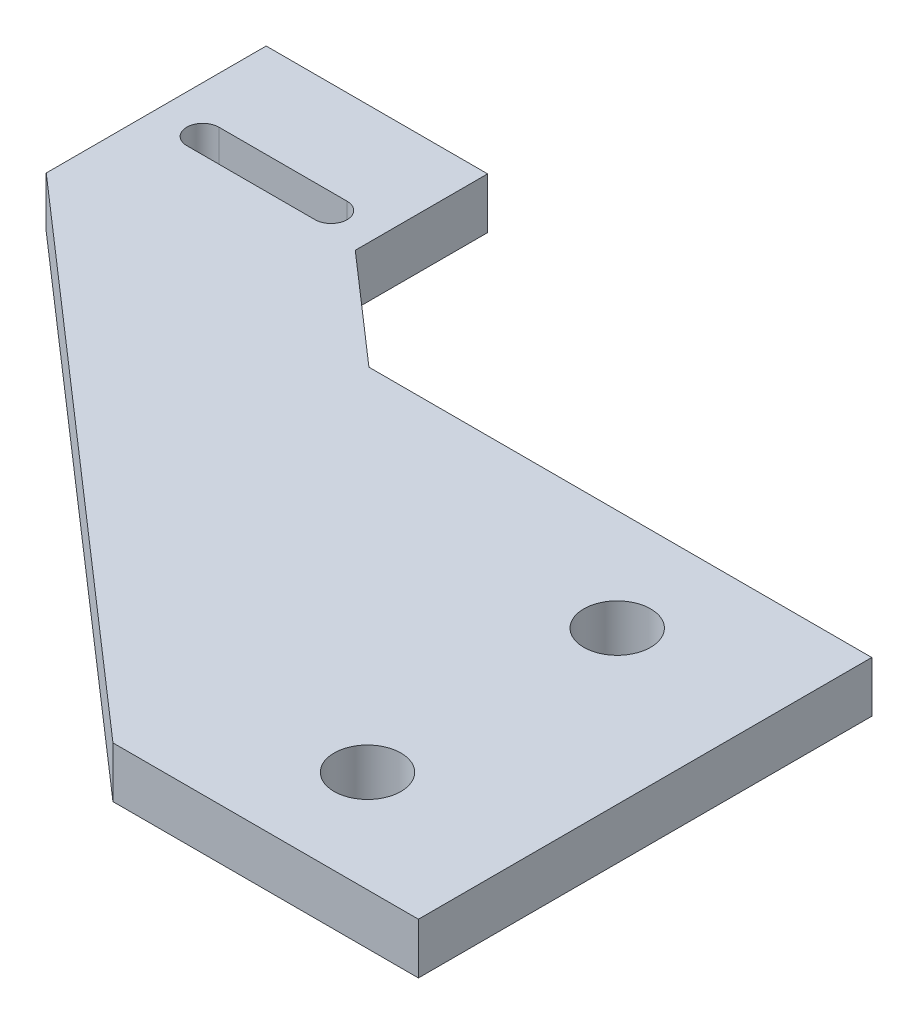
ISO-10303-21;
HEADER;
FILE_DESCRIPTION(('STEP AP214'),'2;1');
FILE_NAME('part.step','',(''),(''),'','','');
FILE_SCHEMA(('AUTOMOTIVE_DESIGN { 1 0 10303 214 1 1 1 1 }'));
ENDSEC;
DATA;
#1=APPLICATION_CONTEXT('core data for automotive mechanical design processes');
#2=APPLICATION_PROTOCOL_DEFINITION('international standard','automotive_design',2000,#1);
#3=PRODUCT_CONTEXT('',#1,'mechanical');
#4=PRODUCT('Part','Part','',(#3));
#5=PRODUCT_RELATED_PRODUCT_CATEGORY('part','',(#4));
#6=PRODUCT_DEFINITION_FORMATION('','',#4);
#7=PRODUCT_DEFINITION_CONTEXT('part definition',#1,'design');
#8=PRODUCT_DEFINITION('design','',#6,#7);
#9=PRODUCT_DEFINITION_SHAPE('','',#8);
#10=(LENGTH_UNIT() NAMED_UNIT(*) SI_UNIT(.MILLI.,.METRE.));
#11=(NAMED_UNIT(*) PLANE_ANGLE_UNIT() SI_UNIT($,.RADIAN.));
#12=(NAMED_UNIT(*) SI_UNIT($,.STERADIAN.) SOLID_ANGLE_UNIT());
#13=UNCERTAINTY_MEASURE_WITH_UNIT(LENGTH_MEASURE(1.E-05),#10,'distance_accuracy_value','');
#14=(GEOMETRIC_REPRESENTATION_CONTEXT(3) GLOBAL_UNCERTAINTY_ASSIGNED_CONTEXT((#13)) GLOBAL_UNIT_ASSIGNED_CONTEXT((#10,
#11,#12)) REPRESENTATION_CONTEXT('',''));
#15=CARTESIAN_POINT('',(0.,0.,0.));
#16=DIRECTION('',(0.,0.,1.));
#17=DIRECTION('',(1.,0.,0.));
#18=AXIS2_PLACEMENT_3D('',#15,#16,#17);
#19=CARTESIAN_POINT('',(628.65,-25.4000000000002,534.61));
#20=DIRECTION('',(1.,0.,0.));
#21=DIRECTION('',(0.,0.,-1.));
#22=AXIS2_PLACEMENT_3D('',#19,#20,#21);
#23=PLANE('',#22);
#24=DIRECTION('',(0.,0.,-1.));
#25=VECTOR('',#24,1.);
#26=CARTESIAN_POINT('',(628.65,-19.0500000000002,534.61));
#27=LINE('',#26,#25);
#28=CARTESIAN_POINT('',(628.65,-19.0500000000002,591.155));
#29=VERTEX_POINT('',#28);
#30=CARTESIAN_POINT('',(628.65,-19.0500000000002,534.61));
#31=VERTEX_POINT('',#30);
#32=EDGE_CURVE('E160',#29,#31,#27,.T.);
#33=ORIENTED_EDGE('',*,*,#32,.F.);
#34=DIRECTION('',(0.,1.,0.));
#35=VECTOR('',#34,1.);
#36=CARTESIAN_POINT('',(628.65,-25.4000000000002,591.155));
#37=LINE('',#36,#35);
#38=CARTESIAN_POINT('',(628.65,-25.4000000000002,591.155));
#39=VERTEX_POINT('',#38);
#40=EDGE_CURVE('E11',#39,#29,#37,.T.);
#41=ORIENTED_EDGE('',*,*,#40,.F.);
#42=DIRECTION('',(0.,0.,-1.));
#43=VECTOR('',#42,1.);
#44=CARTESIAN_POINT('',(628.65,-25.4000000000002,534.61));
#45=LINE('',#44,#43);
#46=CARTESIAN_POINT('',(628.65,-25.4000000000002,534.61));
#47=VERTEX_POINT('',#46);
#48=EDGE_CURVE('E164',#39,#47,#45,.T.);
#49=ORIENTED_EDGE('',*,*,#48,.T.);
#50=DIRECTION('',(0.,1.,0.));
#51=VECTOR('',#50,1.);
#52=CARTESIAN_POINT('',(628.65,-25.4000000000002,534.61));
#53=LINE('',#52,#51);
#54=EDGE_CURVE('E189',#47,#31,#53,.T.);
#55=ORIENTED_EDGE('',*,*,#54,.T.);
#56=EDGE_LOOP('',(#33,#41,#49,#55));
#57=FACE_BOUND('',#56,.T.);
#58=ADVANCED_FACE('F34',(#57),#23,.T.);
#59=CARTESIAN_POINT('',(590.55,-25.4000000000002,591.155));
#60=DIRECTION('',(0.,0.,1.));
#61=DIRECTION('',(1.,0.,0.));
#62=AXIS2_PLACEMENT_3D('',#59,#60,#61);
#63=PLANE('',#62);
#64=DIRECTION('',(1.,0.,0.));
#65=VECTOR('',#64,1.);
#66=CARTESIAN_POINT('',(590.55,-19.0500000000002,591.155));
#67=LINE('',#66,#65);
#68=CARTESIAN_POINT('',(590.55,-19.0500000000002,591.155));
#69=VERTEX_POINT('',#68);
#70=EDGE_CURVE('E168',#69,#29,#67,.T.);
#71=ORIENTED_EDGE('',*,*,#70,.F.);
#72=DIRECTION('',(0.,1.,0.));
#73=VECTOR('',#72,1.);
#74=CARTESIAN_POINT('',(590.55,-25.4000000000002,591.155));
#75=LINE('',#74,#73);
#76=CARTESIAN_POINT('',(590.55,-25.4000000000002,591.155));
#77=VERTEX_POINT('',#76);
#78=EDGE_CURVE('E42',#77,#69,#75,.T.);
#79=ORIENTED_EDGE('',*,*,#78,.F.);
#80=DIRECTION('',(1.,0.,0.));
#81=VECTOR('',#80,1.);
#82=CARTESIAN_POINT('',(590.55,-25.4000000000002,591.155));
#83=LINE('',#82,#81);
#84=EDGE_CURVE('E186',#77,#39,#83,.T.);
#85=ORIENTED_EDGE('',*,*,#84,.T.);
#86=ORIENTED_EDGE('',*,*,#40,.T.);
#87=EDGE_LOOP('',(#71,#79,#85,#86));
#88=FACE_BOUND('',#87,.T.);
#89=ADVANCED_FACE('F246',(#88),#63,.T.);
#90=CARTESIAN_POINT('',(524.83,-25.4000000000002,533.7575));
#91=DIRECTION('',(-0.657806550133243,0.,0.753186924077816));
#92=DIRECTION('',(0.753186924077816,0.,0.657806550133243));
#93=AXIS2_PLACEMENT_3D('',#90,#91,#92);
#94=PLANE('',#93);
#95=DIRECTION('',(0.753186924077816,0.,0.657806550133243));
#96=VECTOR('',#95,1.);
#97=CARTESIAN_POINT('',(524.83,-19.0500000000002,533.7575));
#98=LINE('',#97,#96);
#99=CARTESIAN_POINT('',(524.83,-19.0500000000002,533.7575));
#100=VERTEX_POINT('',#99);
#101=EDGE_CURVE('E207',#100,#69,#98,.T.);
#102=ORIENTED_EDGE('',*,*,#101,.F.);
#103=DIRECTION('',(0.,1.,0.));
#104=VECTOR('',#103,1.);
#105=CARTESIAN_POINT('',(524.83,-25.4000000000002,533.7575));
#106=LINE('',#105,#104);
#107=CARTESIAN_POINT('',(524.83,-25.4000000000002,533.7575));
#108=VERTEX_POINT('',#107);
#109=EDGE_CURVE('E213',#108,#100,#106,.T.);
#110=ORIENTED_EDGE('',*,*,#109,.F.);
#111=DIRECTION('',(0.753186924077816,0.,0.657806550133243));
#112=VECTOR('',#111,1.);
#113=CARTESIAN_POINT('',(524.83,-25.4000000000002,533.7575));
#114=LINE('',#113,#112);
#115=EDGE_CURVE('E183',#108,#77,#114,.T.);
#116=ORIENTED_EDGE('',*,*,#115,.T.);
#117=ORIENTED_EDGE('',*,*,#78,.T.);
#118=EDGE_LOOP('',(#102,#110,#116,#117));
#119=FACE_BOUND('',#118,.T.);
#120=ADVANCED_FACE('F251',(#119),#94,.T.);
#121=CARTESIAN_POINT('',(524.83,-25.4000000000002,533.7575));
#122=DIRECTION('',(-1.,0.,0.));
#123=DIRECTION('',(0.,0.,1.));
#124=AXIS2_PLACEMENT_3D('',#121,#122,#123);
#125=PLANE('',#124);
#126=DIRECTION('',(0.,0.,1.));
#127=VECTOR('',#126,1.);
#128=CARTESIAN_POINT('',(524.83,-19.0500000000002,533.7575));
#129=LINE('',#128,#127);
#130=CARTESIAN_POINT('',(524.83,-19.0500000000002,506.3255));
#131=VERTEX_POINT('',#130);
#132=EDGE_CURVE('E204',#131,#100,#129,.T.);
#133=ORIENTED_EDGE('',*,*,#132,.F.);
#134=DIRECTION('',(0.,1.,0.));
#135=VECTOR('',#134,1.);
#136=CARTESIAN_POINT('',(524.83,-25.4000000000002,506.3255));
#137=LINE('',#136,#135);
#138=CARTESIAN_POINT('',(524.83,-25.4000000000002,506.3255));
#139=VERTEX_POINT('',#138);
#140=EDGE_CURVE('E215',#139,#131,#137,.T.);
#141=ORIENTED_EDGE('',*,*,#140,.F.);
#142=DIRECTION('',(0.,0.,1.));
#143=VECTOR('',#142,1.);
#144=CARTESIAN_POINT('',(524.83,-25.4000000000002,533.7575));
#145=LINE('',#144,#143);
#146=EDGE_CURVE('E180',#139,#108,#145,.T.);
#147=ORIENTED_EDGE('',*,*,#146,.T.);
#148=ORIENTED_EDGE('',*,*,#109,.T.);
#149=EDGE_LOOP('',(#133,#141,#147,#148));
#150=FACE_BOUND('',#149,.T.);
#151=ADVANCED_FACE('F281',(#150),#125,.T.);
#152=CARTESIAN_POINT('',(524.83,-25.4000000000002,506.3255));
#153=DIRECTION('',(0.,0.,-1.));
#154=DIRECTION('',(-1.,0.,0.));
#155=AXIS2_PLACEMENT_3D('',#152,#153,#154);
#156=PLANE('',#155);
#157=DIRECTION('',(-1.,0.,0.));
#158=VECTOR('',#157,1.);
#159=CARTESIAN_POINT('',(524.83,-19.0500000000002,506.3255));
#160=LINE('',#159,#158);
#161=CARTESIAN_POINT('',(552.45,-19.0500000000002,506.3255));
#162=VERTEX_POINT('',#161);
#163=EDGE_CURVE('E201',#162,#131,#160,.T.);
#164=ORIENTED_EDGE('',*,*,#163,.F.);
#165=DIRECTION('',(0.,1.,0.));
#166=VECTOR('',#165,1.);
#167=CARTESIAN_POINT('',(552.45,-25.4000000000002,506.3255));
#168=LINE('',#167,#166);
#169=CARTESIAN_POINT('',(552.45,-25.4000000000002,506.3255));
#170=VERTEX_POINT('',#169);
#171=EDGE_CURVE('E217',#170,#162,#168,.T.);
#172=ORIENTED_EDGE('',*,*,#171,.F.);
#173=DIRECTION('',(-1.,0.,0.));
#174=VECTOR('',#173,1.);
#175=CARTESIAN_POINT('',(524.83,-25.4000000000002,506.3255));
#176=LINE('',#175,#174);
#177=EDGE_CURVE('E177',#170,#139,#176,.T.);
#178=ORIENTED_EDGE('',*,*,#177,.T.);
#179=ORIENTED_EDGE('',*,*,#140,.T.);
#180=EDGE_LOOP('',(#164,#172,#178,#179));
#181=FACE_BOUND('',#180,.T.);
#182=ADVANCED_FACE('F278',(#181),#156,.T.);
#183=CARTESIAN_POINT('',(552.45,-25.4000000000002,506.3255));
#184=DIRECTION('',(1.,0.,0.));
#185=DIRECTION('',(0.,0.,-1.));
#186=AXIS2_PLACEMENT_3D('',#183,#184,#185);
#187=PLANE('',#186);
#188=DIRECTION('',(0.,0.,-1.));
#189=VECTOR('',#188,1.);
#190=CARTESIAN_POINT('',(552.45,-19.0500000000002,506.3255));
#191=LINE('',#190,#189);
#192=CARTESIAN_POINT('',(552.45,-19.0500000000002,522.8355));
#193=VERTEX_POINT('',#192);
#194=EDGE_CURVE('E198',#193,#162,#191,.T.);
#195=ORIENTED_EDGE('',*,*,#194,.F.);
#196=DIRECTION('',(0.,1.,0.));
#197=VECTOR('',#196,1.);
#198=CARTESIAN_POINT('',(552.45,-25.4000000000002,522.8355));
#199=LINE('',#198,#197);
#200=CARTESIAN_POINT('',(552.45,-25.4000000000002,522.8355));
#201=VERTEX_POINT('',#200);
#202=EDGE_CURVE('E219',#201,#193,#199,.T.);
#203=ORIENTED_EDGE('',*,*,#202,.F.);
#204=DIRECTION('',(0.,0.,-1.));
#205=VECTOR('',#204,1.);
#206=CARTESIAN_POINT('',(552.45,-25.4000000000002,506.3255));
#207=LINE('',#206,#205);
#208=EDGE_CURVE('E174',#201,#170,#207,.T.);
#209=ORIENTED_EDGE('',*,*,#208,.T.);
#210=ORIENTED_EDGE('',*,*,#171,.T.);
#211=EDGE_LOOP('',(#195,#203,#209,#210));
#212=FACE_BOUND('',#211,.T.);
#213=ADVANCED_FACE('F274',(#212),#187,.T.);
#214=CARTESIAN_POINT('',(552.45,-25.4000000000002,522.8355));
#215=DIRECTION('',(0.657806550133243,0.,-0.753186924077815));
#216=DIRECTION('',(-0.753186924077816,0.,-0.657806550133243));
#217=AXIS2_PLACEMENT_3D('',#214,#215,#216);
#218=PLANE('',#217);
#219=DIRECTION('',(-0.753186924077815,0.,-0.657806550133243));
#220=VECTOR('',#219,1.);
#221=CARTESIAN_POINT('',(552.45,-19.0500000000002,522.8355));
#222=LINE('',#221,#220);
#223=CARTESIAN_POINT('',(565.931774293306,-19.0500000000002,534.61));
#224=VERTEX_POINT('',#223);
#225=EDGE_CURVE('E195',#224,#193,#222,.T.);
#226=ORIENTED_EDGE('',*,*,#225,.F.);
#227=DIRECTION('',(0.,1.,0.));
#228=VECTOR('',#227,1.);
#229=CARTESIAN_POINT('',(565.931774293306,-25.4000000000002,534.61));
#230=LINE('',#229,#228);
#231=CARTESIAN_POINT('',(565.931774293306,-25.4000000000002,534.61));
#232=VERTEX_POINT('',#231);
#233=EDGE_CURVE('E221',#232,#224,#230,.T.);
#234=ORIENTED_EDGE('',*,*,#233,.F.);
#235=DIRECTION('',(-0.753186924077815,0.,-0.657806550133243));
#236=VECTOR('',#235,1.);
#237=CARTESIAN_POINT('',(552.45,-25.4000000000002,522.8355));
#238=LINE('',#237,#236);
#239=EDGE_CURVE('E171',#232,#201,#238,.T.);
#240=ORIENTED_EDGE('',*,*,#239,.T.);
#241=ORIENTED_EDGE('',*,*,#202,.T.);
#242=EDGE_LOOP('',(#226,#234,#240,#241));
#243=FACE_BOUND('',#242,.T.);
#244=ADVANCED_FACE('F272',(#243),#218,.T.);
#245=CARTESIAN_POINT('',(565.931774293306,-25.4000000000002,534.61));
#246=DIRECTION('',(0.,0.,-1.));
#247=DIRECTION('',(-1.,0.,0.));
#248=AXIS2_PLACEMENT_3D('',#245,#246,#247);
#249=PLANE('',#248);
#250=DIRECTION('',(-1.,0.,0.));
#251=VECTOR('',#250,1.);
#252=CARTESIAN_POINT('',(565.931774293306,-19.0500000000002,534.61));
#253=LINE('',#252,#251);
#254=EDGE_CURVE('E192',#31,#224,#253,.T.);
#255=ORIENTED_EDGE('',*,*,#254,.F.);
#256=ORIENTED_EDGE('',*,*,#54,.F.);
#257=DIRECTION('',(-1.,0.,0.));
#258=VECTOR('',#257,1.);
#259=CARTESIAN_POINT('',(565.931774293306,-25.4000000000002,534.61));
#260=LINE('',#259,#258);
#261=EDGE_CURVE('E167',#47,#232,#260,.T.);
#262=ORIENTED_EDGE('',*,*,#261,.T.);
#263=ORIENTED_EDGE('',*,*,#233,.T.);
#264=EDGE_LOOP('',(#255,#256,#262,#263));
#265=FACE_BOUND('',#264,.T.);
#266=ADVANCED_FACE('F268',(#265),#249,.T.);
#267=CARTESIAN_POINT('',(0.,-25.4000000000002,0.));
#268=DIRECTION('',(0.,1.,0.));
#269=DIRECTION('',(0.,0.,1.));
#270=AXIS2_PLACEMENT_3D('',#267,#268,#269);
#271=PLANE('',#270);
#272=CARTESIAN_POINT('',(609.6,-25.4000000000002,578.455));
#273=DIRECTION('',(0.,1.,0.));
#274=DIRECTION('',(0.,0.,1.));
#275=AXIS2_PLACEMENT_3D('',#272,#273,#274);
#276=CIRCLE('',#275,4.16560000000004);
#277=CARTESIAN_POINT('',(609.6,-25.4000000000002,582.6206));
#278=VERTEX_POINT('',#277);
#279=EDGE_CURVE('E230',#278,#278,#276,.T.);
#280=ORIENTED_EDGE('',*,*,#279,.T.);
#281=EDGE_LOOP('',(#280));
#282=FACE_BOUND('',#281,.T.);
#283=CARTESIAN_POINT('',(609.6,-25.4000000000002,547.31));
#284=DIRECTION('',(0.,1.,0.));
#285=DIRECTION('',(0.,0.,1.));
#286=AXIS2_PLACEMENT_3D('',#283,#284,#285);
#287=CIRCLE('',#286,4.16560000000004);
#288=CARTESIAN_POINT('',(609.6,-25.4000000000002,551.4756));
#289=VERTEX_POINT('',#288);
#290=EDGE_CURVE('E147',#289,#289,#287,.T.);
#291=ORIENTED_EDGE('',*,*,#290,.T.);
#292=EDGE_LOOP('',(#291));
#293=FACE_BOUND('',#292,.T.);
#294=DIRECTION('',(-1.,0.,0.));
#295=VECTOR('',#294,1.);
#296=CARTESIAN_POINT('',(530.64,-25.4000000000002,518.0415));
#297=LINE('',#296,#295);
#298=CARTESIAN_POINT('',(546.64,-25.4000000000002,518.0415));
#299=VERTEX_POINT('',#298);
#300=CARTESIAN_POINT('',(530.64,-25.4000000000002,518.0415));
#301=VERTEX_POINT('',#300);
#302=EDGE_CURVE('E131',#299,#301,#297,.T.);
#303=ORIENTED_EDGE('',*,*,#302,.T.);
#304=CARTESIAN_POINT('',(530.64,-25.4000000000002,520.0415));
#305=DIRECTION('',(0.,1.,0.));
#306=DIRECTION('',(0.,0.,1.));
#307=AXIS2_PLACEMENT_3D('',#304,#305,#306);
#308=CIRCLE('',#307,2.);
#309=CARTESIAN_POINT('',(530.64,-25.4000000000002,522.0415));
#310=VERTEX_POINT('',#309);
#311=EDGE_CURVE('E125',#301,#310,#308,.T.);
#312=ORIENTED_EDGE('',*,*,#311,.T.);
#313=DIRECTION('',(1.,0.,0.));
#314=VECTOR('',#313,1.);
#315=CARTESIAN_POINT('',(530.64,-25.4000000000002,522.0415));
#316=LINE('',#315,#314);
#317=CARTESIAN_POINT('',(546.64,-25.4000000000002,522.0415));
#318=VERTEX_POINT('',#317);
#319=EDGE_CURVE('E134',#310,#318,#316,.T.);
#320=ORIENTED_EDGE('',*,*,#319,.T.);
#321=CARTESIAN_POINT('',(546.64,-25.4000000000002,520.0415));
#322=DIRECTION('',(0.,1.,0.));
#323=DIRECTION('',(0.,0.,1.));
#324=AXIS2_PLACEMENT_3D('',#321,#322,#323);
#325=CIRCLE('',#324,2.);
#326=EDGE_CURVE('E50',#318,#299,#325,.T.);
#327=ORIENTED_EDGE('',*,*,#326,.T.);
#328=EDGE_LOOP('',(#303,#312,#320,#327));
#329=FACE_BOUND('',#328,.T.);
#330=ORIENTED_EDGE('',*,*,#48,.F.);
#331=ORIENTED_EDGE('',*,*,#84,.F.);
#332=ORIENTED_EDGE('',*,*,#115,.F.);
#333=ORIENTED_EDGE('',*,*,#146,.F.);
#334=ORIENTED_EDGE('',*,*,#177,.F.);
#335=ORIENTED_EDGE('',*,*,#208,.F.);
#336=ORIENTED_EDGE('',*,*,#239,.F.);
#337=ORIENTED_EDGE('',*,*,#261,.F.);
#338=EDGE_LOOP('',(#330,#331,#332,#333,#334,#335,#336,#337));
#339=FACE_BOUND('',#338,.T.);
#340=ADVANCED_FACE('F138',(#282,#293,#329,#339),#271,.F.);
#341=CARTESIAN_POINT('',(0.,-19.0500000000002,0.));
#342=DIRECTION('',(0.,1.,0.));
#343=DIRECTION('',(0.,0.,1.));
#344=AXIS2_PLACEMENT_3D('',#341,#342,#343);
#345=PLANE('',#344);
#346=CARTESIAN_POINT('',(609.6,-19.0500000000002,578.455));
#347=DIRECTION('',(0.,1.,0.));
#348=DIRECTION('',(0.,0.,1.));
#349=AXIS2_PLACEMENT_3D('',#346,#347,#348);
#350=CIRCLE('',#349,4.16560000000004);
#351=CARTESIAN_POINT('',(609.6,-19.0500000000002,582.6206));
#352=VERTEX_POINT('',#351);
#353=EDGE_CURVE('E37',#352,#352,#350,.T.);
#354=ORIENTED_EDGE('',*,*,#353,.F.);
#355=EDGE_LOOP('',(#354));
#356=FACE_BOUND('',#355,.T.);
#357=CARTESIAN_POINT('',(609.6,-19.0500000000002,547.31));
#358=DIRECTION('',(0.,1.,0.));
#359=DIRECTION('',(0.,0.,1.));
#360=AXIS2_PLACEMENT_3D('',#357,#358,#359);
#361=CIRCLE('',#360,4.16560000000004);
#362=CARTESIAN_POINT('',(609.6,-19.0500000000002,551.4756));
#363=VERTEX_POINT('',#362);
#364=EDGE_CURVE('E154',#363,#363,#361,.T.);
#365=ORIENTED_EDGE('',*,*,#364,.F.);
#366=EDGE_LOOP('',(#365));
#367=FACE_BOUND('',#366,.T.);
#368=CARTESIAN_POINT('',(530.64,-19.0500000000002,520.0415));
#369=DIRECTION('',(0.,1.,0.));
#370=DIRECTION('',(0.,0.,1.));
#371=AXIS2_PLACEMENT_3D('',#368,#369,#370);
#372=CIRCLE('',#371,2.);
#373=CARTESIAN_POINT('',(530.64,-19.0500000000002,518.0415));
#374=VERTEX_POINT('',#373);
#375=CARTESIAN_POINT('',(530.64,-19.0500000000002,522.0415));
#376=VERTEX_POINT('',#375);
#377=EDGE_CURVE('E58',#374,#376,#372,.T.);
#378=ORIENTED_EDGE('',*,*,#377,.F.);
#379=DIRECTION('',(-1.,0.,0.));
#380=VECTOR('',#379,1.);
#381=CARTESIAN_POINT('',(530.64,-19.0500000000002,518.0415));
#382=LINE('',#381,#380);
#383=CARTESIAN_POINT('',(546.64,-19.0500000000002,518.0415));
#384=VERTEX_POINT('',#383);
#385=EDGE_CURVE('E141',#384,#374,#382,.T.);
#386=ORIENTED_EDGE('',*,*,#385,.F.);
#387=CARTESIAN_POINT('',(546.64,-19.0500000000002,520.0415));
#388=DIRECTION('',(0.,1.,0.));
#389=DIRECTION('',(0.,0.,1.));
#390=AXIS2_PLACEMENT_3D('',#387,#388,#389);
#391=CIRCLE('',#390,2.);
#392=CARTESIAN_POINT('',(546.64,-19.0500000000002,522.0415));
#393=VERTEX_POINT('',#392);
#394=EDGE_CURVE('E144',#393,#384,#391,.T.);
#395=ORIENTED_EDGE('',*,*,#394,.F.);
#396=DIRECTION('',(1.,0.,0.));
#397=VECTOR('',#396,1.);
#398=CARTESIAN_POINT('',(530.64,-19.0500000000002,522.0415));
#399=LINE('',#398,#397);
#400=EDGE_CURVE('E153',#376,#393,#399,.T.);
#401=ORIENTED_EDGE('',*,*,#400,.F.);
#402=EDGE_LOOP('',(#378,#386,#395,#401));
#403=FACE_BOUND('',#402,.T.);
#404=ORIENTED_EDGE('',*,*,#32,.T.);
#405=ORIENTED_EDGE('',*,*,#254,.T.);
#406=ORIENTED_EDGE('',*,*,#225,.T.);
#407=ORIENTED_EDGE('',*,*,#194,.T.);
#408=ORIENTED_EDGE('',*,*,#163,.T.);
#409=ORIENTED_EDGE('',*,*,#132,.T.);
#410=ORIENTED_EDGE('',*,*,#101,.T.);
#411=ORIENTED_EDGE('',*,*,#70,.T.);
#412=EDGE_LOOP('',(#404,#405,#406,#407,#408,#409,#410,#411));
#413=FACE_BOUND('',#412,.T.);
#414=ADVANCED_FACE('F259',(#356,#367,#403,#413),#345,.T.);
#415=CARTESIAN_POINT('',(530.64,-25.4000000000002,520.0415));
#416=DIRECTION('',(0.,1.,0.));
#417=DIRECTION('',(0.,0.,1.));
#418=AXIS2_PLACEMENT_3D('',#415,#416,#417);
#419=CYLINDRICAL_SURFACE('',#418,2.);
#420=ORIENTED_EDGE('',*,*,#377,.T.);
#421=DIRECTION('',(0.,1.,0.));
#422=VECTOR('',#421,1.);
#423=CARTESIAN_POINT('',(530.64,-25.4000000000002,522.0415));
#424=LINE('',#423,#422);
#425=EDGE_CURVE('E121',#310,#376,#424,.T.);
#426=ORIENTED_EDGE('',*,*,#425,.F.);
#427=ORIENTED_EDGE('',*,*,#311,.F.);
#428=DIRECTION('',(0.,1.,0.));
#429=VECTOR('',#428,1.);
#430=CARTESIAN_POINT('',(530.64,-25.4000000000002,518.0415));
#431=LINE('',#430,#429);
#432=EDGE_CURVE('E158',#301,#374,#431,.T.);
#433=ORIENTED_EDGE('',*,*,#432,.T.);
#434=EDGE_LOOP('',(#420,#426,#427,#433));
#435=FACE_BOUND('',#434,.T.);
#436=ADVANCED_FACE('F123',(#435),#419,.F.);
#437=CARTESIAN_POINT('',(530.64,-25.4000000000002,518.0415));
#438=DIRECTION('',(0.,0.,-1.));
#439=DIRECTION('',(-1.,0.,0.));
#440=AXIS2_PLACEMENT_3D('',#437,#438,#439);
#441=PLANE('',#440);
#442=ORIENTED_EDGE('',*,*,#385,.T.);
#443=ORIENTED_EDGE('',*,*,#432,.F.);
#444=ORIENTED_EDGE('',*,*,#302,.F.);
#445=DIRECTION('',(0.,1.,0.));
#446=VECTOR('',#445,1.);
#447=CARTESIAN_POINT('',(546.64,-25.4000000000002,518.0415));
#448=LINE('',#447,#446);
#449=EDGE_CURVE('E161',#299,#384,#448,.T.);
#450=ORIENTED_EDGE('',*,*,#449,.T.);
#451=EDGE_LOOP('',(#442,#443,#444,#450));
#452=FACE_BOUND('',#451,.T.);
#453=ADVANCED_FACE('F308',(#452),#441,.F.);
#454=CARTESIAN_POINT('',(546.64,-25.4000000000002,520.0415));
#455=DIRECTION('',(0.,1.,0.));
#456=DIRECTION('',(0.,0.,1.));
#457=AXIS2_PLACEMENT_3D('',#454,#455,#456);
#458=CYLINDRICAL_SURFACE('',#457,2.);
#459=ORIENTED_EDGE('',*,*,#394,.T.);
#460=ORIENTED_EDGE('',*,*,#449,.F.);
#461=ORIENTED_EDGE('',*,*,#326,.F.);
#462=DIRECTION('',(0.,1.,0.));
#463=VECTOR('',#462,1.);
#464=CARTESIAN_POINT('',(546.64,-25.4000000000002,522.0415));
#465=LINE('',#464,#463);
#466=EDGE_CURVE('E130',#318,#393,#465,.T.);
#467=ORIENTED_EDGE('',*,*,#466,.T.);
#468=EDGE_LOOP('',(#459,#460,#461,#467));
#469=FACE_BOUND('',#468,.T.);
#470=ADVANCED_FACE('F311',(#469),#458,.F.);
#471=CARTESIAN_POINT('',(530.64,-25.4000000000002,522.0415));
#472=DIRECTION('',(0.,0.,1.));
#473=DIRECTION('',(1.,0.,0.));
#474=AXIS2_PLACEMENT_3D('',#471,#472,#473);
#475=PLANE('',#474);
#476=ORIENTED_EDGE('',*,*,#400,.T.);
#477=ORIENTED_EDGE('',*,*,#466,.F.);
#478=ORIENTED_EDGE('',*,*,#319,.F.);
#479=ORIENTED_EDGE('',*,*,#425,.T.);
#480=EDGE_LOOP('',(#476,#477,#478,#479));
#481=FACE_BOUND('',#480,.T.);
#482=ADVANCED_FACE('F135',(#481),#475,.F.);
#483=CARTESIAN_POINT('',(609.6,-25.4000000000002,547.31));
#484=DIRECTION('',(0.,1.,0.));
#485=DIRECTION('',(0.,0.,1.));
#486=AXIS2_PLACEMENT_3D('',#483,#484,#485);
#487=CYLINDRICAL_SURFACE('',#486,4.16560000000004);
#488=ORIENTED_EDGE('',*,*,#364,.T.);
#489=EDGE_LOOP('',(#488));
#490=FACE_BOUND('',#489,.T.);
#491=ORIENTED_EDGE('',*,*,#290,.F.);
#492=EDGE_LOOP('',(#491));
#493=FACE_BOUND('',#492,.T.);
#494=ADVANCED_FACE('F239',(#490,#493),#487,.F.);
#495=CARTESIAN_POINT('',(609.6,-25.4000000000002,578.455));
#496=DIRECTION('',(0.,1.,0.));
#497=DIRECTION('',(0.,0.,1.));
#498=AXIS2_PLACEMENT_3D('',#495,#496,#497);
#499=CYLINDRICAL_SURFACE('',#498,4.16560000000004);
#500=ORIENTED_EDGE('',*,*,#353,.T.);
#501=EDGE_LOOP('',(#500));
#502=FACE_BOUND('',#501,.T.);
#503=ORIENTED_EDGE('',*,*,#279,.F.);
#504=EDGE_LOOP('',(#503));
#505=FACE_BOUND('',#504,.T.);
#506=ADVANCED_FACE('F237',(#502,#505),#499,.F.);
#507=CLOSED_SHELL('',(#58,#89,#120,#151,#182,#213,#244,#266,#340,#414,#436,#453,#470,#482,#494,#506));
#508=MANIFOLD_SOLID_BREP('B2',#507);
#509=ADVANCED_BREP_SHAPE_REPRESENTATION('',(#18,#508),#14);
#510=SHAPE_DEFINITION_REPRESENTATION(#9,#509);
ENDSEC;
END-ISO-10303-21;
